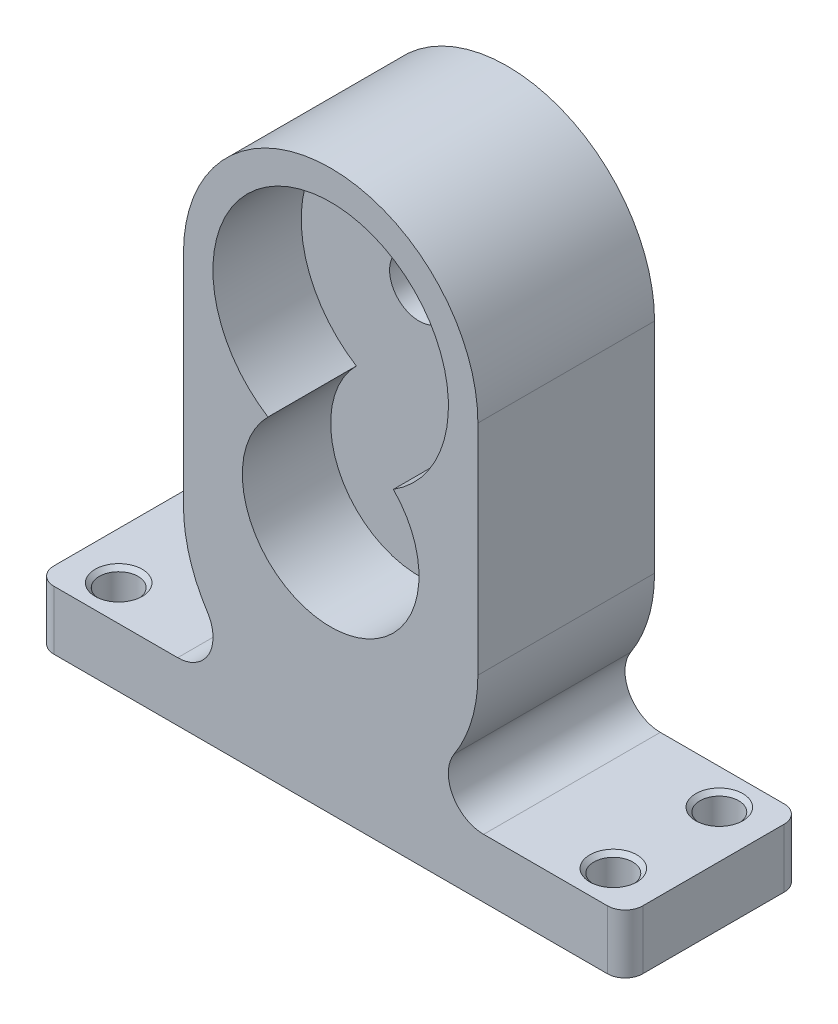
ISO-10303-21;
HEADER;
FILE_DESCRIPTION(('STEP AP214'),'2;1');
FILE_NAME('part.step','',(''),(''),'','','');
FILE_SCHEMA(('AUTOMOTIVE_DESIGN { 1 0 10303 214 1 1 1 1 }'));
ENDSEC;
DATA;
#1=APPLICATION_CONTEXT('core data for automotive mechanical design processes');
#2=APPLICATION_PROTOCOL_DEFINITION('international standard','automotive_design',2000,#1);
#3=PRODUCT_CONTEXT('',#1,'mechanical');
#4=PRODUCT('Part','Part','',(#3));
#5=PRODUCT_RELATED_PRODUCT_CATEGORY('part','',(#4));
#6=PRODUCT_DEFINITION_FORMATION('','',#4);
#7=PRODUCT_DEFINITION_CONTEXT('part definition',#1,'design');
#8=PRODUCT_DEFINITION('design','',#6,#7);
#9=PRODUCT_DEFINITION_SHAPE('','',#8);
#10=(LENGTH_UNIT() NAMED_UNIT(*) SI_UNIT(.MILLI.,.METRE.));
#11=(NAMED_UNIT(*) PLANE_ANGLE_UNIT() SI_UNIT($,.RADIAN.));
#12=(NAMED_UNIT(*) SI_UNIT($,.STERADIAN.) SOLID_ANGLE_UNIT());
#13=UNCERTAINTY_MEASURE_WITH_UNIT(LENGTH_MEASURE(1.E-05),#10,'distance_accuracy_value','');
#14=(GEOMETRIC_REPRESENTATION_CONTEXT(3) GLOBAL_UNCERTAINTY_ASSIGNED_CONTEXT((#13)) GLOBAL_UNIT_ASSIGNED_CONTEXT((#10,
#11,#12)) REPRESENTATION_CONTEXT('',''));
#15=CARTESIAN_POINT('',(0.,0.,0.));
#16=DIRECTION('',(0.,0.,1.));
#17=DIRECTION('',(1.,0.,0.));
#18=AXIS2_PLACEMENT_3D('',#15,#16,#17);
#19=CARTESIAN_POINT('',(0.,0.,-30.));
#20=DIRECTION('',(0.,-1.,0.));
#21=DIRECTION('',(0.,0.,-1.));
#22=AXIS2_PLACEMENT_3D('',#19,#20,#21);
#23=PLANE('',#22);
#24=CARTESIAN_POINT('',(-42.,0.,-6.));
#25=DIRECTION('',(0.,1.,0.));
#26=DIRECTION('',(0.,0.,1.));
#27=AXIS2_PLACEMENT_3D('',#24,#25,#26);
#28=CIRCLE('',#27,3.3);
#29=CARTESIAN_POINT('',(-42.,0.,-2.7));
#30=VERTEX_POINT('',#29);
#31=EDGE_CURVE('E582',#30,#30,#28,.T.);
#32=ORIENTED_EDGE('',*,*,#31,.T.);
#33=EDGE_LOOP('',(#32));
#34=FACE_BOUND('',#33,.T.);
#35=DIRECTION('',(0.,0.,1.));
#36=VECTOR('',#35,1.);
#37=CARTESIAN_POINT('',(-50.,0.,-30.));
#38=LINE('',#37,#36);
#39=CARTESIAN_POINT('',(-50.,0.,-27.));
#40=VERTEX_POINT('',#39);
#41=CARTESIAN_POINT('',(-50.,0.,-3.));
#42=VERTEX_POINT('',#41);
#43=EDGE_CURVE('E218',#40,#42,#38,.T.);
#44=ORIENTED_EDGE('',*,*,#43,.F.);
#45=CARTESIAN_POINT('',(-47.,0.,-27.));
#46=DIRECTION('',(0.,-1.,0.));
#47=DIRECTION('',(0.,0.,-1.));
#48=AXIS2_PLACEMENT_3D('',#45,#46,#47);
#49=CIRCLE('',#48,3.);
#50=CARTESIAN_POINT('',(-47.,0.,-30.));
#51=VERTEX_POINT('',#50);
#52=EDGE_CURVE('E339',#40,#51,#49,.T.);
#53=ORIENTED_EDGE('',*,*,#52,.T.);
#54=DIRECTION('',(1.,0.,0.));
#55=VECTOR('',#54,1.);
#56=CARTESIAN_POINT('',(0.,0.,-30.));
#57=LINE('',#56,#55);
#58=CARTESIAN_POINT('',(47.,0.,-30.));
#59=VERTEX_POINT('',#58);
#60=EDGE_CURVE('E234',#51,#59,#57,.T.);
#61=ORIENTED_EDGE('',*,*,#60,.T.);
#62=CARTESIAN_POINT('',(47.,0.,-27.));
#63=DIRECTION('',(0.,-1.,0.));
#64=DIRECTION('',(0.,0.,-1.));
#65=AXIS2_PLACEMENT_3D('',#62,#63,#64);
#66=CIRCLE('',#65,3.);
#67=CARTESIAN_POINT('',(50.,0.,-27.));
#68=VERTEX_POINT('',#67);
#69=EDGE_CURVE('E330',#59,#68,#66,.T.);
#70=ORIENTED_EDGE('',*,*,#69,.T.);
#71=DIRECTION('',(0.,0.,1.));
#72=VECTOR('',#71,1.);
#73=CARTESIAN_POINT('',(50.,0.,-30.));
#74=LINE('',#73,#72);
#75=CARTESIAN_POINT('',(50.,0.,-3.));
#76=VERTEX_POINT('',#75);
#77=EDGE_CURVE('E252',#68,#76,#74,.T.);
#78=ORIENTED_EDGE('',*,*,#77,.T.);
#79=CARTESIAN_POINT('',(47.,0.,-3.));
#80=DIRECTION('',(0.,-1.,0.));
#81=DIRECTION('',(0.,0.,-1.));
#82=AXIS2_PLACEMENT_3D('',#79,#80,#81);
#83=CIRCLE('',#82,3.);
#84=CARTESIAN_POINT('',(47.,0.,0.));
#85=VERTEX_POINT('',#84);
#86=EDGE_CURVE('E333',#76,#85,#83,.T.);
#87=ORIENTED_EDGE('',*,*,#86,.T.);
#88=DIRECTION('',(1.,0.,0.));
#89=VECTOR('',#88,1.);
#90=CARTESIAN_POINT('',(0.,0.,0.));
#91=LINE('',#90,#89);
#92=CARTESIAN_POINT('',(-47.,0.,0.));
#93=VERTEX_POINT('',#92);
#94=EDGE_CURVE('E222',#93,#85,#91,.T.);
#95=ORIENTED_EDGE('',*,*,#94,.F.);
#96=CARTESIAN_POINT('',(-47.,0.,-3.));
#97=DIRECTION('',(0.,-1.,0.));
#98=DIRECTION('',(0.,0.,-1.));
#99=AXIS2_PLACEMENT_3D('',#96,#97,#98);
#100=CIRCLE('',#99,3.);
#101=EDGE_CURVE('E336',#93,#42,#100,.T.);
#102=ORIENTED_EDGE('',*,*,#101,.T.);
#103=EDGE_LOOP('',(#44,#53,#61,#70,#78,#87,#95,#102));
#104=FACE_BOUND('',#103,.T.);
#105=CARTESIAN_POINT('',(42.,0.,-24.));
#106=DIRECTION('',(0.,1.,0.));
#107=DIRECTION('',(0.,0.,1.));
#108=AXIS2_PLACEMENT_3D('',#105,#106,#107);
#109=CIRCLE('',#108,3.3);
#110=CARTESIAN_POINT('',(42.,0.,-20.7));
#111=VERTEX_POINT('',#110);
#112=EDGE_CURVE('E533',#111,#111,#109,.T.);
#113=ORIENTED_EDGE('',*,*,#112,.T.);
#114=EDGE_LOOP('',(#113));
#115=FACE_BOUND('',#114,.T.);
#116=CARTESIAN_POINT('',(-42.,0.,-24.));
#117=DIRECTION('',(0.,1.,0.));
#118=DIRECTION('',(0.,0.,1.));
#119=AXIS2_PLACEMENT_3D('',#116,#117,#118);
#120=CIRCLE('',#119,3.3);
#121=CARTESIAN_POINT('',(-42.,0.,-20.7));
#122=VERTEX_POINT('',#121);
#123=EDGE_CURVE('E528',#122,#122,#120,.T.);
#124=ORIENTED_EDGE('',*,*,#123,.T.);
#125=EDGE_LOOP('',(#124));
#126=FACE_BOUND('',#125,.T.);
#127=CARTESIAN_POINT('',(42.,0.,-6.));
#128=DIRECTION('',(0.,1.,0.));
#129=DIRECTION('',(0.,0.,1.));
#130=AXIS2_PLACEMENT_3D('',#127,#128,#129);
#131=CIRCLE('',#130,3.3);
#132=CARTESIAN_POINT('',(42.,0.,-2.7));
#133=VERTEX_POINT('',#132);
#134=EDGE_CURVE('E561',#133,#133,#131,.T.);
#135=ORIENTED_EDGE('',*,*,#134,.T.);
#136=EDGE_LOOP('',(#135));
#137=FACE_BOUND('',#136,.T.);
#138=ADVANCED_FACE('F39',(#34,#104,#115,#126,#137),#23,.T.);
#139=CARTESIAN_POINT('',(0.,70.,-30.));
#140=DIRECTION('',(0.,0.,1.));
#141=DIRECTION('',(1.,0.,0.));
#142=AXIS2_PLACEMENT_3D('',#139,#140,#141);
#143=CYLINDRICAL_SURFACE('',#142,25.);
#144=CARTESIAN_POINT('',(0.,70.,0.));
#145=DIRECTION('',(0.,0.,1.));
#146=DIRECTION('',(-1.,0.,0.));
#147=AXIS2_PLACEMENT_3D('',#144,#145,#146);
#148=CIRCLE('',#147,25.);
#149=CARTESIAN_POINT('',(25.,70.,0.));
#150=VERTEX_POINT('',#149);
#151=CARTESIAN_POINT('',(-25.,70.,0.));
#152=VERTEX_POINT('',#151);
#153=EDGE_CURVE('E239',#150,#152,#148,.T.);
#154=ORIENTED_EDGE('',*,*,#153,.F.);
#155=DIRECTION('',(0.,0.,1.));
#156=VECTOR('',#155,1.);
#157=CARTESIAN_POINT('',(25.,70.,-30.));
#158=LINE('',#157,#156);
#159=CARTESIAN_POINT('',(25.,70.,-30.));
#160=VERTEX_POINT('',#159);
#161=EDGE_CURVE('E268',#160,#150,#158,.T.);
#162=ORIENTED_EDGE('',*,*,#161,.F.);
#163=CARTESIAN_POINT('',(0.,70.,-30.));
#164=DIRECTION('',(0.,0.,1.));
#165=DIRECTION('',(-1.,0.,0.));
#166=AXIS2_PLACEMENT_3D('',#163,#164,#165);
#167=CIRCLE('',#166,25.);
#168=CARTESIAN_POINT('',(-25.,70.,-30.));
#169=VERTEX_POINT('',#168);
#170=EDGE_CURVE('E249',#160,#169,#167,.T.);
#171=ORIENTED_EDGE('',*,*,#170,.T.);
#172=DIRECTION('',(0.,0.,1.));
#173=VECTOR('',#172,1.);
#174=CARTESIAN_POINT('',(-25.,70.,-30.));
#175=LINE('',#174,#173);
#176=EDGE_CURVE('E212',#169,#152,#175,.T.);
#177=ORIENTED_EDGE('',*,*,#176,.T.);
#178=EDGE_LOOP('',(#154,#162,#171,#177));
#179=FACE_BOUND('',#178,.T.);
#180=ADVANCED_FACE('F409',(#179),#143,.T.);
#181=CARTESIAN_POINT('',(25.,70.,-30.));
#182=DIRECTION('',(1.,0.,0.));
#183=DIRECTION('',(0.,0.,-1.));
#184=AXIS2_PLACEMENT_3D('',#181,#182,#183);
#185=PLANE('',#184);
#186=DIRECTION('',(0.,1.,0.));
#187=VECTOR('',#186,1.);
#188=CARTESIAN_POINT('',(25.,70.,0.));
#189=LINE('',#188,#187);
#190=CARTESIAN_POINT('',(25.,32.9128784747792,0.));
#191=VERTEX_POINT('',#190);
#192=EDGE_CURVE('E262',#191,#150,#189,.T.);
#193=ORIENTED_EDGE('',*,*,#192,.F.);
#194=DIRECTION('',(0.,0.,1.));
#195=VECTOR('',#194,1.);
#196=CARTESIAN_POINT('',(25.,32.9128784747792,-30.));
#197=LINE('',#196,#195);
#198=CARTESIAN_POINT('',(25.,32.9128784747792,-30.));
#199=VERTEX_POINT('',#198);
#200=EDGE_CURVE('E272',#199,#191,#197,.T.);
#201=ORIENTED_EDGE('',*,*,#200,.F.);
#202=DIRECTION('',(0.,1.,0.));
#203=VECTOR('',#202,1.);
#204=CARTESIAN_POINT('',(25.,70.,-30.));
#205=LINE('',#204,#203);
#206=EDGE_CURVE('E245',#199,#160,#205,.T.);
#207=ORIENTED_EDGE('',*,*,#206,.T.);
#208=ORIENTED_EDGE('',*,*,#161,.T.);
#209=EDGE_LOOP('',(#193,#201,#207,#208));
#210=FACE_BOUND('',#209,.T.);
#211=ADVANCED_FACE('F413',(#210),#185,.T.);
#212=CARTESIAN_POINT('',(0.,32.9128784747792,-30.));
#213=DIRECTION('',(0.,0.,1.));
#214=DIRECTION('',(1.,0.,0.));
#215=AXIS2_PLACEMENT_3D('',#212,#213,#214);
#216=CYLINDRICAL_SURFACE('',#215,25.);
#217=CARTESIAN_POINT('',(0.,32.9128784747792,0.));
#218=DIRECTION('',(0.,0.,1.));
#219=DIRECTION('',(-1.,0.,0.));
#220=AXIS2_PLACEMENT_3D('',#217,#218,#219);
#221=CIRCLE('',#220,25.);
#222=CARTESIAN_POINT('',(20.9515219785169,19.2734603499573,0.));
#223=VERTEX_POINT('',#222);
#224=EDGE_CURVE('E259',#223,#191,#221,.T.);
#225=ORIENTED_EDGE('',*,*,#224,.F.);
#226=DIRECTION('',(0.,0.,1.));
#227=VECTOR('',#226,1.);
#228=CARTESIAN_POINT('',(20.9515219785169,19.2734603499573,-30.));
#229=LINE('',#228,#227);
#230=CARTESIAN_POINT('',(20.9515219785169,19.2734603499573,-30.));
#231=VERTEX_POINT('',#230);
#232=EDGE_CURVE('E293',#223,#231,#229,.F.);
#233=ORIENTED_EDGE('',*,*,#232,.T.);
#234=CARTESIAN_POINT('',(0.,32.9128784747792,-30.));
#235=DIRECTION('',(0.,0.,1.));
#236=DIRECTION('',(-1.,0.,0.));
#237=AXIS2_PLACEMENT_3D('',#234,#235,#236);
#238=CIRCLE('',#237,25.);
#239=EDGE_CURVE('E242',#231,#199,#238,.T.);
#240=ORIENTED_EDGE('',*,*,#239,.T.);
#241=ORIENTED_EDGE('',*,*,#200,.T.);
#242=EDGE_LOOP('',(#225,#233,#240,#241));
#243=FACE_BOUND('',#242,.T.);
#244=ADVANCED_FACE('F416',(#243),#216,.T.);
#245=CARTESIAN_POINT('',(50.,10.,-30.));
#246=DIRECTION('',(0.,1.,0.));
#247=DIRECTION('',(-1.,0.,0.));
#248=AXIS2_PLACEMENT_3D('',#245,#246,#247);
#249=PLANE('',#248);
#250=CARTESIAN_POINT('',(42.,10.,-6.));
#251=DIRECTION('',(0.,1.,0.));
#252=DIRECTION('',(0.,0.,1.));
#253=AXIS2_PLACEMENT_3D('',#250,#251,#252);
#254=CIRCLE('',#253,4.);
#255=CARTESIAN_POINT('',(42.,10.,-2.00000000000001));
#256=VERTEX_POINT('',#255);
#257=EDGE_CURVE('E521',#256,#256,#254,.T.);
#258=ORIENTED_EDGE('',*,*,#257,.F.);
#259=EDGE_LOOP('',(#258));
#260=FACE_BOUND('',#259,.T.);
#261=CARTESIAN_POINT('',(42.,10.,-24.));
#262=DIRECTION('',(0.,1.,0.));
#263=DIRECTION('',(0.,0.,1.));
#264=AXIS2_PLACEMENT_3D('',#261,#262,#263);
#265=CIRCLE('',#264,4.);
#266=CARTESIAN_POINT('',(42.,10.,-20.));
#267=VERTEX_POINT('',#266);
#268=EDGE_CURVE('E524',#267,#267,#265,.T.);
#269=ORIENTED_EDGE('',*,*,#268,.F.);
#270=EDGE_LOOP('',(#269));
#271=FACE_BOUND('',#270,.T.);
#272=DIRECTION('',(-1.,0.,0.));
#273=VECTOR('',#272,1.);
#274=CARTESIAN_POINT('',(50.,10.,0.));
#275=LINE('',#274,#273);
#276=CARTESIAN_POINT('',(47.,10.,0.));
#277=VERTEX_POINT('',#276);
#278=CARTESIAN_POINT('',(25.979887253361,10.,0.));
#279=VERTEX_POINT('',#278);
#280=EDGE_CURVE('E256',#277,#279,#275,.T.);
#281=ORIENTED_EDGE('',*,*,#280,.F.);
#282=CARTESIAN_POINT('',(47.,10.,-3.));
#283=DIRECTION('',(0.,1.,0.));
#284=DIRECTION('',(-1.,0.,0.));
#285=AXIS2_PLACEMENT_3D('',#282,#283,#284);
#286=CIRCLE('',#285,3.);
#287=CARTESIAN_POINT('',(50.,10.,-3.));
#288=VERTEX_POINT('',#287);
#289=EDGE_CURVE('E55',#277,#288,#286,.T.);
#290=ORIENTED_EDGE('',*,*,#289,.T.);
#291=DIRECTION('',(0.,0.,1.));
#292=VECTOR('',#291,1.);
#293=CARTESIAN_POINT('',(50.,10.,-30.));
#294=LINE('',#293,#292);
#295=CARTESIAN_POINT('',(50.,10.,-27.));
#296=VERTEX_POINT('',#295);
#297=EDGE_CURVE('E276',#296,#288,#294,.T.);
#298=ORIENTED_EDGE('',*,*,#297,.F.);
#299=CARTESIAN_POINT('',(47.,10.,-27.));
#300=DIRECTION('',(0.,1.,0.));
#301=DIRECTION('',(-1.,0.,0.));
#302=AXIS2_PLACEMENT_3D('',#299,#300,#301);
#303=CIRCLE('',#302,3.);
#304=CARTESIAN_POINT('',(47.,10.,-30.));
#305=VERTEX_POINT('',#304);
#306=EDGE_CURVE('E63',#296,#305,#303,.T.);
#307=ORIENTED_EDGE('',*,*,#306,.T.);
#308=DIRECTION('',(-1.,0.,0.));
#309=VECTOR('',#308,1.);
#310=CARTESIAN_POINT('',(50.,10.,-30.));
#311=LINE('',#310,#309);
#312=CARTESIAN_POINT('',(25.979887253361,10.,-30.));
#313=VERTEX_POINT('',#312);
#314=EDGE_CURVE('E238',#305,#313,#311,.T.);
#315=ORIENTED_EDGE('',*,*,#314,.T.);
#316=DIRECTION('',(0.,0.,-1.));
#317=VECTOR('',#316,1.);
#318=CARTESIAN_POINT('',(25.979887253361,10.,0.));
#319=LINE('',#318,#317);
#320=EDGE_CURVE('E289',#313,#279,#319,.F.);
#321=ORIENTED_EDGE('',*,*,#320,.T.);
#322=EDGE_LOOP('',(#281,#290,#298,#307,#315,#321));
#323=FACE_BOUND('',#322,.T.);
#324=ADVANCED_FACE('F358',(#260,#271,#323),#249,.T.);
#325=CARTESIAN_POINT('',(50.,0.,-30.));
#326=DIRECTION('',(1.,0.,0.));
#327=DIRECTION('',(0.,0.,-1.));
#328=AXIS2_PLACEMENT_3D('',#325,#326,#327);
#329=PLANE('',#328);
#330=ORIENTED_EDGE('',*,*,#297,.T.);
#331=DIRECTION('',(0.,1.,0.));
#332=VECTOR('',#331,1.);
#333=CARTESIAN_POINT('',(50.,0.,-3.));
#334=LINE('',#333,#332);
#335=EDGE_CURVE('E11',#288,#76,#334,.F.);
#336=ORIENTED_EDGE('',*,*,#335,.T.);
#337=ORIENTED_EDGE('',*,*,#77,.F.);
#338=DIRECTION('',(0.,1.,0.));
#339=VECTOR('',#338,1.);
#340=CARTESIAN_POINT('',(50.,0.,-27.));
#341=LINE('',#340,#339);
#342=EDGE_CURVE('E48',#68,#296,#341,.T.);
#343=ORIENTED_EDGE('',*,*,#342,.T.);
#344=EDGE_LOOP('',(#330,#336,#337,#343));
#345=FACE_BOUND('',#344,.T.);
#346=ADVANCED_FACE('F355',(#345),#329,.T.);
#347=CARTESIAN_POINT('',(0.,70.,-30.));
#348=DIRECTION('',(0.,0.,-1.));
#349=DIRECTION('',(-1.,0.,0.));
#350=AXIS2_PLACEMENT_3D('',#347,#348,#349);
#351=PLANE('',#350);
#352=CARTESIAN_POINT('',(0.,70.,-30.));
#353=DIRECTION('',(0.,0.,1.));
#354=DIRECTION('',(1.,0.,0.));
#355=AXIS2_PLACEMENT_3D('',#352,#353,#354);
#356=CIRCLE('',#355,5.);
#357=CARTESIAN_POINT('',(5.,70.,-30.));
#358=VERTEX_POINT('',#357);
#359=EDGE_CURVE('E196',#358,#358,#356,.T.);
#360=ORIENTED_EDGE('',*,*,#359,.T.);
#361=EDGE_LOOP('',(#360));
#362=FACE_BOUND('',#361,.T.);
#363=ORIENTED_EDGE('',*,*,#60,.F.);
#364=DIRECTION('',(0.,1.,0.));
#365=VECTOR('',#364,1.);
#366=CARTESIAN_POINT('',(-47.,10.,-30.));
#367=LINE('',#366,#365);
#368=CARTESIAN_POINT('',(-47.,10.,-30.));
#369=VERTEX_POINT('',#368);
#370=EDGE_CURVE('E313',#51,#369,#367,.T.);
#371=ORIENTED_EDGE('',*,*,#370,.T.);
#372=DIRECTION('',(1.,0.,0.));
#373=VECTOR('',#372,1.);
#374=CARTESIAN_POINT('',(-50.,10.,-30.));
#375=LINE('',#374,#373);
#376=CARTESIAN_POINT('',(-25.979887253361,10.,-30.));
#377=VERTEX_POINT('',#376);
#378=EDGE_CURVE('E210',#369,#377,#375,.T.);
#379=ORIENTED_EDGE('',*,*,#378,.T.);
#380=CARTESIAN_POINT('',(-25.979887253361,16.,-30.));
#381=DIRECTION('',(0.,0.,-1.));
#382=DIRECTION('',(-1.,0.,0.));
#383=AXIS2_PLACEMENT_3D('',#380,#381,#382);
#384=CIRCLE('',#383,6.);
#385=CARTESIAN_POINT('',(-20.9515219785169,19.2734603499573,-30.));
#386=VERTEX_POINT('',#385);
#387=EDGE_CURVE('E300',#377,#386,#384,.F.);
#388=ORIENTED_EDGE('',*,*,#387,.T.);
#389=CARTESIAN_POINT('',(0.,32.9128784747792,-30.));
#390=DIRECTION('',(0.,0.,-1.));
#391=DIRECTION('',(1.,0.,0.));
#392=AXIS2_PLACEMENT_3D('',#389,#390,#391);
#393=CIRCLE('',#392,25.);
#394=CARTESIAN_POINT('',(-25.,32.9128784747792,-30.));
#395=VERTEX_POINT('',#394);
#396=EDGE_CURVE('E206',#386,#395,#393,.T.);
#397=ORIENTED_EDGE('',*,*,#396,.T.);
#398=DIRECTION('',(0.,1.,0.));
#399=VECTOR('',#398,1.);
#400=CARTESIAN_POINT('',(-25.,70.,-30.));
#401=LINE('',#400,#399);
#402=EDGE_CURVE('E202',#395,#169,#401,.T.);
#403=ORIENTED_EDGE('',*,*,#402,.T.);
#404=ORIENTED_EDGE('',*,*,#170,.F.);
#405=ORIENTED_EDGE('',*,*,#206,.F.);
#406=ORIENTED_EDGE('',*,*,#239,.F.);
#407=CARTESIAN_POINT('',(25.979887253361,16.,-30.));
#408=DIRECTION('',(0.,0.,-1.));
#409=DIRECTION('',(-1.,0.,0.));
#410=AXIS2_PLACEMENT_3D('',#407,#408,#409);
#411=CIRCLE('',#410,6.);
#412=EDGE_CURVE('E306',#231,#313,#411,.F.);
#413=ORIENTED_EDGE('',*,*,#412,.T.);
#414=ORIENTED_EDGE('',*,*,#314,.F.);
#415=DIRECTION('',(0.,1.,0.));
#416=VECTOR('',#415,1.);
#417=CARTESIAN_POINT('',(47.,70.,-30.));
#418=LINE('',#417,#416);
#419=EDGE_CURVE('E310',#305,#59,#418,.F.);
#420=ORIENTED_EDGE('',*,*,#419,.T.);
#421=EDGE_LOOP('',(#363,#371,#379,#388,#397,#403,#404,#405,#406,#413,#414,#420));
#422=FACE_BOUND('',#421,.T.);
#423=ADVANCED_FACE('F362',(#362,#422),#351,.T.);
#424=CARTESIAN_POINT('',(0.,70.,0.));
#425=DIRECTION('',(0.,0.,-1.));
#426=DIRECTION('',(-1.,0.,0.));
#427=AXIS2_PLACEMENT_3D('',#424,#425,#426);
#428=PLANE('',#427);
#429=CARTESIAN_POINT('',(0.,70.,0.));
#430=DIRECTION('',(0.,0.,1.));
#431=DIRECTION('',(1.,0.,0.));
#432=AXIS2_PLACEMENT_3D('',#429,#430,#431);
#433=CIRCLE('',#432,20.);
#434=CARTESIAN_POINT('',(10.6448829518155,53.0681818181818,0.));
#435=VERTEX_POINT('',#434);
#436=CARTESIAN_POINT('',(-10.6448829518155,53.0681818181818,0.));
#437=VERTEX_POINT('',#436);
#438=EDGE_CURVE('E183',#435,#437,#433,.T.);
#439=ORIENTED_EDGE('',*,*,#438,.F.);
#440=CARTESIAN_POINT('',(0.,42.5,0.));
#441=DIRECTION('',(0.,0.,1.));
#442=DIRECTION('',(1.,0.,0.));
#443=AXIS2_PLACEMENT_3D('',#440,#441,#442);
#444=CIRCLE('',#443,15.);
#445=EDGE_CURVE('E176',#437,#435,#444,.T.);
#446=ORIENTED_EDGE('',*,*,#445,.F.);
#447=EDGE_LOOP('',(#439,#446));
#448=FACE_BOUND('',#447,.T.);
#449=DIRECTION('',(1.,0.,0.));
#450=VECTOR('',#449,1.);
#451=CARTESIAN_POINT('',(-50.,10.,0.));
#452=LINE('',#451,#450);
#453=CARTESIAN_POINT('',(-47.,10.,0.));
#454=VERTEX_POINT('',#453);
#455=CARTESIAN_POINT('',(-25.979887253361,10.,0.));
#456=VERTEX_POINT('',#455);
#457=EDGE_CURVE('E207',#454,#456,#452,.T.);
#458=ORIENTED_EDGE('',*,*,#457,.F.);
#459=DIRECTION('',(0.,1.,0.));
#460=VECTOR('',#459,1.);
#461=CARTESIAN_POINT('',(-47.,70.,0.));
#462=LINE('',#461,#460);
#463=EDGE_CURVE('E346',#454,#93,#462,.F.);
#464=ORIENTED_EDGE('',*,*,#463,.T.);
#465=ORIENTED_EDGE('',*,*,#94,.T.);
#466=DIRECTION('',(0.,1.,0.));
#467=VECTOR('',#466,1.);
#468=CARTESIAN_POINT('',(47.,10.,0.));
#469=LINE('',#468,#467);
#470=EDGE_CURVE('E342',#85,#277,#469,.T.);
#471=ORIENTED_EDGE('',*,*,#470,.T.);
#472=ORIENTED_EDGE('',*,*,#280,.T.);
#473=CARTESIAN_POINT('',(25.979887253361,16.,0.));
#474=DIRECTION('',(0.,0.,-1.));
#475=DIRECTION('',(-1.,0.,0.));
#476=AXIS2_PLACEMENT_3D('',#473,#474,#475);
#477=CIRCLE('',#476,6.);
#478=EDGE_CURVE('E303',#279,#223,#477,.T.);
#479=ORIENTED_EDGE('',*,*,#478,.T.);
#480=ORIENTED_EDGE('',*,*,#224,.T.);
#481=ORIENTED_EDGE('',*,*,#192,.T.);
#482=ORIENTED_EDGE('',*,*,#153,.T.);
#483=DIRECTION('',(0.,1.,0.));
#484=VECTOR('',#483,1.);
#485=CARTESIAN_POINT('',(-25.,70.,0.));
#486=LINE('',#485,#484);
#487=CARTESIAN_POINT('',(-25.,32.9128784747792,0.));
#488=VERTEX_POINT('',#487);
#489=EDGE_CURVE('E189',#488,#152,#486,.T.);
#490=ORIENTED_EDGE('',*,*,#489,.F.);
#491=CARTESIAN_POINT('',(0.,32.9128784747792,0.));
#492=DIRECTION('',(0.,0.,-1.));
#493=DIRECTION('',(1.,0.,0.));
#494=AXIS2_PLACEMENT_3D('',#491,#492,#493);
#495=CIRCLE('',#494,25.);
#496=CARTESIAN_POINT('',(-20.9515219785169,19.2734603499573,0.));
#497=VERTEX_POINT('',#496);
#498=EDGE_CURVE('E194',#497,#488,#495,.T.);
#499=ORIENTED_EDGE('',*,*,#498,.F.);
#500=CARTESIAN_POINT('',(-25.979887253361,16.,0.));
#501=DIRECTION('',(0.,0.,-1.));
#502=DIRECTION('',(-1.,0.,0.));
#503=AXIS2_PLACEMENT_3D('',#500,#501,#502);
#504=CIRCLE('',#503,6.);
#505=EDGE_CURVE('E296',#497,#456,#504,.T.);
#506=ORIENTED_EDGE('',*,*,#505,.T.);
#507=EDGE_LOOP('',(#458,#464,#465,#471,#472,#479,#480,#481,#482,#490,#499,#506));
#508=FACE_BOUND('',#507,.T.);
#509=ADVANCED_FACE('F388',(#448,#508),#428,.F.);
#510=CARTESIAN_POINT('',(-50.,0.,-30.));
#511=DIRECTION('',(1.,0.,0.));
#512=DIRECTION('',(0.,0.,-1.));
#513=AXIS2_PLACEMENT_3D('',#510,#511,#512);
#514=PLANE('',#513);
#515=DIRECTION('',(0.,0.,1.));
#516=VECTOR('',#515,1.);
#517=CARTESIAN_POINT('',(-50.,10.,-30.));
#518=LINE('',#517,#516);
#519=CARTESIAN_POINT('',(-50.,10.,-27.));
#520=VERTEX_POINT('',#519);
#521=CARTESIAN_POINT('',(-50.,10.,-3.));
#522=VERTEX_POINT('',#521);
#523=EDGE_CURVE('E223',#520,#522,#518,.T.);
#524=ORIENTED_EDGE('',*,*,#523,.F.);
#525=DIRECTION('',(0.,1.,0.));
#526=VECTOR('',#525,1.);
#527=CARTESIAN_POINT('',(-50.,0.,-27.));
#528=LINE('',#527,#526);
#529=EDGE_CURVE('E327',#520,#40,#528,.F.);
#530=ORIENTED_EDGE('',*,*,#529,.T.);
#531=ORIENTED_EDGE('',*,*,#43,.T.);
#532=DIRECTION('',(0.,1.,0.));
#533=VECTOR('',#532,1.);
#534=CARTESIAN_POINT('',(-50.,0.,-3.));
#535=LINE('',#534,#533);
#536=EDGE_CURVE('E323',#42,#522,#535,.T.);
#537=ORIENTED_EDGE('',*,*,#536,.T.);
#538=EDGE_LOOP('',(#524,#530,#531,#537));
#539=FACE_BOUND('',#538,.T.);
#540=ADVANCED_FACE('F380',(#539),#514,.F.);
#541=CARTESIAN_POINT('',(-50.,10.,-30.));
#542=DIRECTION('',(0.,-1.,0.));
#543=DIRECTION('',(1.,0.,0.));
#544=AXIS2_PLACEMENT_3D('',#541,#542,#543);
#545=PLANE('',#544);
#546=CARTESIAN_POINT('',(-42.,9.99999999999999,-6.));
#547=DIRECTION('',(0.,1.,0.));
#548=DIRECTION('',(0.,0.,1.));
#549=AXIS2_PLACEMENT_3D('',#546,#547,#548);
#550=CIRCLE('',#549,4.);
#551=CARTESIAN_POINT('',(-42.,9.99999999999999,-2.00000000000001));
#552=VERTEX_POINT('',#551);
#553=EDGE_CURVE('E589',#552,#552,#550,.T.);
#554=ORIENTED_EDGE('',*,*,#553,.F.);
#555=EDGE_LOOP('',(#554));
#556=FACE_BOUND('',#555,.T.);
#557=CARTESIAN_POINT('',(-42.,9.99999999999999,-24.));
#558=DIRECTION('',(0.,1.,0.));
#559=DIRECTION('',(0.,0.,1.));
#560=AXIS2_PLACEMENT_3D('',#557,#558,#559);
#561=CIRCLE('',#560,4.);
#562=CARTESIAN_POINT('',(-42.,9.99999999999999,-20.));
#563=VERTEX_POINT('',#562);
#564=EDGE_CURVE('E563',#563,#563,#561,.T.);
#565=ORIENTED_EDGE('',*,*,#564,.F.);
#566=EDGE_LOOP('',(#565));
#567=FACE_BOUND('',#566,.T.);
#568=ORIENTED_EDGE('',*,*,#378,.F.);
#569=CARTESIAN_POINT('',(-47.,10.,-27.));
#570=DIRECTION('',(0.,-1.,0.));
#571=DIRECTION('',(1.,0.,0.));
#572=AXIS2_PLACEMENT_3D('',#569,#570,#571);
#573=CIRCLE('',#572,3.);
#574=EDGE_CURVE('E320',#369,#520,#573,.F.);
#575=ORIENTED_EDGE('',*,*,#574,.T.);
#576=ORIENTED_EDGE('',*,*,#523,.T.);
#577=CARTESIAN_POINT('',(-47.,10.,-3.));
#578=DIRECTION('',(0.,-1.,0.));
#579=DIRECTION('',(1.,0.,0.));
#580=AXIS2_PLACEMENT_3D('',#577,#578,#579);
#581=CIRCLE('',#580,3.);
#582=EDGE_CURVE('E317',#522,#454,#581,.F.);
#583=ORIENTED_EDGE('',*,*,#582,.T.);
#584=ORIENTED_EDGE('',*,*,#457,.T.);
#585=DIRECTION('',(0.,0.,-1.));
#586=VECTOR('',#585,1.);
#587=CARTESIAN_POINT('',(-25.979887253361,10.,-30.));
#588=LINE('',#587,#586);
#589=EDGE_CURVE('E285',#456,#377,#588,.T.);
#590=ORIENTED_EDGE('',*,*,#589,.T.);
#591=EDGE_LOOP('',(#568,#575,#576,#583,#584,#590));
#592=FACE_BOUND('',#591,.T.);
#593=ADVANCED_FACE('F378',(#556,#567,#592),#545,.F.);
#594=CARTESIAN_POINT('',(0.,32.9128784747792,-30.));
#595=DIRECTION('',(0.,0.,1.));
#596=DIRECTION('',(1.,0.,0.));
#597=AXIS2_PLACEMENT_3D('',#594,#595,#596);
#598=CYLINDRICAL_SURFACE('',#597,25.);
#599=ORIENTED_EDGE('',*,*,#396,.F.);
#600=DIRECTION('',(0.,0.,1.));
#601=VECTOR('',#600,1.);
#602=CARTESIAN_POINT('',(-20.9515219785169,19.2734603499573,-30.));
#603=LINE('',#602,#601);
#604=EDGE_CURVE('E271',#386,#497,#603,.T.);
#605=ORIENTED_EDGE('',*,*,#604,.T.);
#606=ORIENTED_EDGE('',*,*,#498,.T.);
#607=DIRECTION('',(0.,0.,1.));
#608=VECTOR('',#607,1.);
#609=CARTESIAN_POINT('',(-25.,32.9128784747792,-30.));
#610=LINE('',#609,#608);
#611=EDGE_CURVE('E227',#395,#488,#610,.T.);
#612=ORIENTED_EDGE('',*,*,#611,.F.);
#613=EDGE_LOOP('',(#599,#605,#606,#612));
#614=FACE_BOUND('',#613,.T.);
#615=ADVANCED_FACE('F400',(#614),#598,.T.);
#616=CARTESIAN_POINT('',(-25.,70.,-30.));
#617=DIRECTION('',(1.,0.,0.));
#618=DIRECTION('',(0.,0.,-1.));
#619=AXIS2_PLACEMENT_3D('',#616,#617,#618);
#620=PLANE('',#619);
#621=ORIENTED_EDGE('',*,*,#489,.T.);
#622=ORIENTED_EDGE('',*,*,#176,.F.);
#623=ORIENTED_EDGE('',*,*,#402,.F.);
#624=ORIENTED_EDGE('',*,*,#611,.T.);
#625=EDGE_LOOP('',(#621,#622,#623,#624));
#626=FACE_BOUND('',#625,.T.);
#627=ADVANCED_FACE('F404',(#626),#620,.F.);
#628=CARTESIAN_POINT('',(0.,70.,-15.));
#629=DIRECTION('',(0.,0.,1.));
#630=DIRECTION('',(1.,0.,0.));
#631=AXIS2_PLACEMENT_3D('',#628,#629,#630);
#632=CYLINDRICAL_SURFACE('',#631,20.);
#633=CARTESIAN_POINT('',(0.,70.,-15.));
#634=DIRECTION('',(0.,0.,1.));
#635=DIRECTION('',(1.,0.,0.));
#636=AXIS2_PLACEMENT_3D('',#633,#634,#635);
#637=CIRCLE('',#636,20.);
#638=CARTESIAN_POINT('',(10.6448829518155,53.0681818181818,-15.));
#639=VERTEX_POINT('',#638);
#640=CARTESIAN_POINT('',(-10.6448829518155,53.0681818181818,-15.));
#641=VERTEX_POINT('',#640);
#642=EDGE_CURVE('E181',#639,#641,#637,.T.);
#643=ORIENTED_EDGE('',*,*,#642,.F.);
#644=DIRECTION('',(0.,0.,1.));
#645=VECTOR('',#644,1.);
#646=CARTESIAN_POINT('',(10.6448829518155,53.0681818181818,-7.5));
#647=LINE('',#646,#645);
#648=EDGE_CURVE('E171',#639,#435,#647,.T.);
#649=ORIENTED_EDGE('',*,*,#648,.T.);
#650=ORIENTED_EDGE('',*,*,#438,.T.);
#651=DIRECTION('',(0.,0.,1.));
#652=VECTOR('',#651,1.);
#653=CARTESIAN_POINT('',(-10.6448829518155,53.0681818181818,-7.5));
#654=LINE('',#653,#652);
#655=EDGE_CURVE('E168',#437,#641,#654,.F.);
#656=ORIENTED_EDGE('',*,*,#655,.T.);
#657=EDGE_LOOP('',(#643,#649,#650,#656));
#658=FACE_BOUND('',#657,.T.);
#659=ADVANCED_FACE('F180',(#658),#632,.F.);
#660=CARTESIAN_POINT('',(0.,70.,-15.));
#661=DIRECTION('',(0.,0.,1.));
#662=DIRECTION('',(1.,0.,0.));
#663=AXIS2_PLACEMENT_3D('',#660,#661,#662);
#664=PLANE('',#663);
#665=ORIENTED_EDGE('',*,*,#642,.T.);
#666=CARTESIAN_POINT('',(0.,42.5,-15.));
#667=DIRECTION('',(0.,0.,1.));
#668=DIRECTION('',(1.,0.,0.));
#669=AXIS2_PLACEMENT_3D('',#666,#667,#668);
#670=CIRCLE('',#669,15.);
#671=EDGE_CURVE('E165',#641,#639,#670,.T.);
#672=ORIENTED_EDGE('',*,*,#671,.T.);
#673=EDGE_LOOP('',(#665,#672));
#674=FACE_BOUND('',#673,.T.);
#675=CARTESIAN_POINT('',(0.,70.,-15.));
#676=DIRECTION('',(0.,0.,1.));
#677=DIRECTION('',(1.,0.,0.));
#678=AXIS2_PLACEMENT_3D('',#675,#676,#677);
#679=CIRCLE('',#678,5.);
#680=CARTESIAN_POINT('',(5.,70.,-15.));
#681=VERTEX_POINT('',#680);
#682=EDGE_CURVE('E199',#681,#681,#679,.T.);
#683=ORIENTED_EDGE('',*,*,#682,.F.);
#684=EDGE_LOOP('',(#683));
#685=FACE_BOUND('',#684,.T.);
#686=ADVANCED_FACE('F186',(#674,#685),#664,.T.);
#687=CARTESIAN_POINT('',(0.,70.,-30.));
#688=DIRECTION('',(0.,0.,1.));
#689=DIRECTION('',(1.,0.,0.));
#690=AXIS2_PLACEMENT_3D('',#687,#688,#689);
#691=CYLINDRICAL_SURFACE('',#690,5.);
#692=ORIENTED_EDGE('',*,*,#359,.F.);
#693=EDGE_LOOP('',(#692));
#694=FACE_BOUND('',#693,.T.);
#695=ORIENTED_EDGE('',*,*,#682,.T.);
#696=EDGE_LOOP('',(#695));
#697=FACE_BOUND('',#696,.T.);
#698=ADVANCED_FACE('F443',(#694,#697),#691,.F.);
#699=CARTESIAN_POINT('',(-25.979887253361,16.,-30.));
#700=DIRECTION('',(0.,0.,1.));
#701=DIRECTION('',(1.,0.,0.));
#702=AXIS2_PLACEMENT_3D('',#699,#700,#701);
#703=CYLINDRICAL_SURFACE('',#702,6.);
#704=ORIENTED_EDGE('',*,*,#387,.F.);
#705=ORIENTED_EDGE('',*,*,#589,.F.);
#706=ORIENTED_EDGE('',*,*,#505,.F.);
#707=ORIENTED_EDGE('',*,*,#604,.F.);
#708=EDGE_LOOP('',(#704,#705,#706,#707));
#709=FACE_BOUND('',#708,.T.);
#710=ADVANCED_FACE('F396',(#709),#703,.F.);
#711=CARTESIAN_POINT('',(25.979887253361,16.,-30.));
#712=DIRECTION('',(0.,0.,1.));
#713=DIRECTION('',(1.,0.,0.));
#714=AXIS2_PLACEMENT_3D('',#711,#712,#713);
#715=CYLINDRICAL_SURFACE('',#714,6.);
#716=ORIENTED_EDGE('',*,*,#412,.F.);
#717=ORIENTED_EDGE('',*,*,#232,.F.);
#718=ORIENTED_EDGE('',*,*,#478,.F.);
#719=ORIENTED_EDGE('',*,*,#320,.F.);
#720=EDGE_LOOP('',(#716,#717,#718,#719));
#721=FACE_BOUND('',#720,.T.);
#722=ADVANCED_FACE('F419',(#721),#715,.F.);
#723=CARTESIAN_POINT('',(0.,42.5,-15.));
#724=DIRECTION('',(0.,0.,1.));
#725=DIRECTION('',(1.,0.,0.));
#726=AXIS2_PLACEMENT_3D('',#723,#724,#725);
#727=CYLINDRICAL_SURFACE('',#726,15.);
#728=ORIENTED_EDGE('',*,*,#671,.F.);
#729=ORIENTED_EDGE('',*,*,#655,.F.);
#730=ORIENTED_EDGE('',*,*,#445,.T.);
#731=ORIENTED_EDGE('',*,*,#648,.F.);
#732=EDGE_LOOP('',(#728,#729,#730,#731));
#733=FACE_BOUND('',#732,.T.);
#734=ADVANCED_FACE('F167',(#733),#727,.F.);
#735=CARTESIAN_POINT('',(42.,10.,-24.));
#736=DIRECTION('',(0.,1.,0.));
#737=DIRECTION('',(0.,0.,1.));
#738=AXIS2_PLACEMENT_3D('',#735,#736,#737);
#739=CYLINDRICAL_SURFACE('',#738,3.3);
#740=ORIENTED_EDGE('',*,*,#112,.F.);
#741=EDGE_LOOP('',(#740));
#742=FACE_BOUND('',#741,.T.);
#743=CARTESIAN_POINT('',(42.,9.3,-24.));
#744=DIRECTION('',(0.,1.,0.));
#745=DIRECTION('',(0.,0.,1.));
#746=AXIS2_PLACEMENT_3D('',#743,#744,#745);
#747=CIRCLE('',#746,3.3);
#748=CARTESIAN_POINT('',(42.,9.3,-20.7));
#749=VERTEX_POINT('',#748);
#750=EDGE_CURVE('E527',#749,#749,#747,.T.);
#751=ORIENTED_EDGE('',*,*,#750,.T.);
#752=EDGE_LOOP('',(#751));
#753=FACE_BOUND('',#752,.T.);
#754=ADVANCED_FACE('F481',(#742,#753),#739,.F.);
#755=CARTESIAN_POINT('',(42.,10.,-24.));
#756=DIRECTION('',(0.,1.,0.));
#757=DIRECTION('',(0.,0.,1.));
#758=AXIS2_PLACEMENT_3D('',#755,#756,#757);
#759=CONICAL_SURFACE('',#758,4.,0.785398163397448);
#760=ORIENTED_EDGE('',*,*,#750,.F.);
#761=EDGE_LOOP('',(#760));
#762=FACE_BOUND('',#761,.T.);
#763=ORIENTED_EDGE('',*,*,#268,.T.);
#764=EDGE_LOOP('',(#763));
#765=FACE_BOUND('',#764,.T.);
#766=ADVANCED_FACE('F477',(#762,#765),#759,.F.);
#767=CARTESIAN_POINT('',(-42.,9.99999999999999,-24.));
#768=DIRECTION('',(0.,1.,0.));
#769=DIRECTION('',(0.,0.,1.));
#770=AXIS2_PLACEMENT_3D('',#767,#768,#769);
#771=CYLINDRICAL_SURFACE('',#770,3.3);
#772=ORIENTED_EDGE('',*,*,#123,.F.);
#773=EDGE_LOOP('',(#772));
#774=FACE_BOUND('',#773,.T.);
#775=CARTESIAN_POINT('',(-42.,9.29999999999999,-24.));
#776=DIRECTION('',(0.,1.,0.));
#777=DIRECTION('',(0.,0.,1.));
#778=AXIS2_PLACEMENT_3D('',#775,#776,#777);
#779=CIRCLE('',#778,3.3);
#780=CARTESIAN_POINT('',(-42.,9.29999999999999,-20.7));
#781=VERTEX_POINT('',#780);
#782=EDGE_CURVE('E536',#781,#781,#779,.T.);
#783=ORIENTED_EDGE('',*,*,#782,.T.);
#784=EDGE_LOOP('',(#783));
#785=FACE_BOUND('',#784,.T.);
#786=ADVANCED_FACE('F473',(#774,#785),#771,.F.);
#787=CARTESIAN_POINT('',(-42.,9.99999999999999,-24.));
#788=DIRECTION('',(0.,1.,0.));
#789=DIRECTION('',(0.,0.,1.));
#790=AXIS2_PLACEMENT_3D('',#787,#788,#789);
#791=CONICAL_SURFACE('',#790,4.,0.785398163397448);
#792=ORIENTED_EDGE('',*,*,#782,.F.);
#793=EDGE_LOOP('',(#792));
#794=FACE_BOUND('',#793,.T.);
#795=ORIENTED_EDGE('',*,*,#564,.T.);
#796=EDGE_LOOP('',(#795));
#797=FACE_BOUND('',#796,.T.);
#798=ADVANCED_FACE('F469',(#794,#797),#791,.F.);
#799=CARTESIAN_POINT('',(42.,10.,-6.));
#800=DIRECTION('',(0.,1.,0.));
#801=DIRECTION('',(0.,0.,1.));
#802=AXIS2_PLACEMENT_3D('',#799,#800,#801);
#803=CYLINDRICAL_SURFACE('',#802,3.3);
#804=ORIENTED_EDGE('',*,*,#134,.F.);
#805=EDGE_LOOP('',(#804));
#806=FACE_BOUND('',#805,.T.);
#807=CARTESIAN_POINT('',(42.,9.3,-6.));
#808=DIRECTION('',(0.,1.,0.));
#809=DIRECTION('',(0.,0.,1.));
#810=AXIS2_PLACEMENT_3D('',#807,#808,#809);
#811=CIRCLE('',#810,3.3);
#812=CARTESIAN_POINT('',(42.,9.3,-2.7));
#813=VERTEX_POINT('',#812);
#814=EDGE_CURVE('E564',#813,#813,#811,.T.);
#815=ORIENTED_EDGE('',*,*,#814,.T.);
#816=EDGE_LOOP('',(#815));
#817=FACE_BOUND('',#816,.T.);
#818=ADVANCED_FACE('F465',(#806,#817),#803,.F.);
#819=CARTESIAN_POINT('',(42.,10.,-6.));
#820=DIRECTION('',(0.,1.,0.));
#821=DIRECTION('',(0.,0.,1.));
#822=AXIS2_PLACEMENT_3D('',#819,#820,#821);
#823=CONICAL_SURFACE('',#822,4.,0.785398163397448);
#824=ORIENTED_EDGE('',*,*,#814,.F.);
#825=EDGE_LOOP('',(#824));
#826=FACE_BOUND('',#825,.T.);
#827=ORIENTED_EDGE('',*,*,#257,.T.);
#828=EDGE_LOOP('',(#827));
#829=FACE_BOUND('',#828,.T.);
#830=ADVANCED_FACE('F457',(#826,#829),#823,.F.);
#831=CARTESIAN_POINT('',(-42.,9.99999999999999,-6.));
#832=DIRECTION('',(0.,1.,0.));
#833=DIRECTION('',(0.,0.,1.));
#834=AXIS2_PLACEMENT_3D('',#831,#832,#833);
#835=CYLINDRICAL_SURFACE('',#834,3.3);
#836=ORIENTED_EDGE('',*,*,#31,.F.);
#837=EDGE_LOOP('',(#836));
#838=FACE_BOUND('',#837,.T.);
#839=CARTESIAN_POINT('',(-42.,9.29999999999999,-6.));
#840=DIRECTION('',(0.,1.,0.));
#841=DIRECTION('',(0.,0.,1.));
#842=AXIS2_PLACEMENT_3D('',#839,#840,#841);
#843=CIRCLE('',#842,3.3);
#844=CARTESIAN_POINT('',(-42.,9.29999999999999,-2.7));
#845=VERTEX_POINT('',#844);
#846=EDGE_CURVE('E585',#845,#845,#843,.T.);
#847=ORIENTED_EDGE('',*,*,#846,.T.);
#848=EDGE_LOOP('',(#847));
#849=FACE_BOUND('',#848,.T.);
#850=ADVANCED_FACE('F451',(#838,#849),#835,.F.);
#851=CARTESIAN_POINT('',(-42.,9.99999999999999,-6.));
#852=DIRECTION('',(0.,1.,0.));
#853=DIRECTION('',(0.,0.,1.));
#854=AXIS2_PLACEMENT_3D('',#851,#852,#853);
#855=CONICAL_SURFACE('',#854,4.,0.785398163397448);
#856=ORIENTED_EDGE('',*,*,#846,.F.);
#857=EDGE_LOOP('',(#856));
#858=FACE_BOUND('',#857,.T.);
#859=ORIENTED_EDGE('',*,*,#553,.T.);
#860=EDGE_LOOP('',(#859));
#861=FACE_BOUND('',#860,.T.);
#862=ADVANCED_FACE('F447',(#858,#861),#855,.F.);
#863=CARTESIAN_POINT('',(-47.,70.,-27.));
#864=DIRECTION('',(0.,-1.,0.));
#865=DIRECTION('',(0.,0.,-1.));
#866=AXIS2_PLACEMENT_3D('',#863,#864,#865);
#867=CYLINDRICAL_SURFACE('',#866,3.);
#868=ORIENTED_EDGE('',*,*,#52,.F.);
#869=ORIENTED_EDGE('',*,*,#529,.F.);
#870=ORIENTED_EDGE('',*,*,#574,.F.);
#871=ORIENTED_EDGE('',*,*,#370,.F.);
#872=EDGE_LOOP('',(#868,#869,#870,#871));
#873=FACE_BOUND('',#872,.T.);
#874=ADVANCED_FACE('F374',(#873),#867,.T.);
#875=CARTESIAN_POINT('',(-47.,0.,-3.));
#876=DIRECTION('',(0.,1.,0.));
#877=DIRECTION('',(0.,0.,1.));
#878=AXIS2_PLACEMENT_3D('',#875,#876,#877);
#879=CYLINDRICAL_SURFACE('',#878,3.);
#880=ORIENTED_EDGE('',*,*,#101,.F.);
#881=ORIENTED_EDGE('',*,*,#463,.F.);
#882=ORIENTED_EDGE('',*,*,#582,.F.);
#883=ORIENTED_EDGE('',*,*,#536,.F.);
#884=EDGE_LOOP('',(#880,#881,#882,#883));
#885=FACE_BOUND('',#884,.T.);
#886=ADVANCED_FACE('F384',(#885),#879,.T.);
#887=CARTESIAN_POINT('',(47.,70.,-3.));
#888=DIRECTION('',(0.,-1.,0.));
#889=DIRECTION('',(0.,0.,-1.));
#890=AXIS2_PLACEMENT_3D('',#887,#888,#889);
#891=CYLINDRICAL_SURFACE('',#890,3.);
#892=ORIENTED_EDGE('',*,*,#86,.F.);
#893=ORIENTED_EDGE('',*,*,#335,.F.);
#894=ORIENTED_EDGE('',*,*,#289,.F.);
#895=ORIENTED_EDGE('',*,*,#470,.F.);
#896=EDGE_LOOP('',(#892,#893,#894,#895));
#897=FACE_BOUND('',#896,.T.);
#898=ADVANCED_FACE('F423',(#897),#891,.T.);
#899=CARTESIAN_POINT('',(47.,0.,-27.));
#900=DIRECTION('',(0.,1.,0.));
#901=DIRECTION('',(0.,0.,1.));
#902=AXIS2_PLACEMENT_3D('',#899,#900,#901);
#903=CYLINDRICAL_SURFACE('',#902,3.);
#904=ORIENTED_EDGE('',*,*,#69,.F.);
#905=ORIENTED_EDGE('',*,*,#419,.F.);
#906=ORIENTED_EDGE('',*,*,#306,.F.);
#907=ORIENTED_EDGE('',*,*,#342,.F.);
#908=EDGE_LOOP('',(#904,#905,#906,#907));
#909=FACE_BOUND('',#908,.T.);
#910=ADVANCED_FACE('F41',(#909),#903,.T.);
#911=CLOSED_SHELL('',(#138,#180,#211,#244,#324,#346,#423,#509,#540,#593,#615,#627,#659,#686,
#698,#710,#722,#734,#754,#766,#786,#798,#818,#830,#850,#862,#874,#886,#898,#910));
#912=MANIFOLD_SOLID_BREP('B2',#911);
#913=ADVANCED_BREP_SHAPE_REPRESENTATION('',(#18,#912),#14);
#914=SHAPE_DEFINITION_REPRESENTATION(#9,#913);
ENDSEC;
END-ISO-10303-21;
